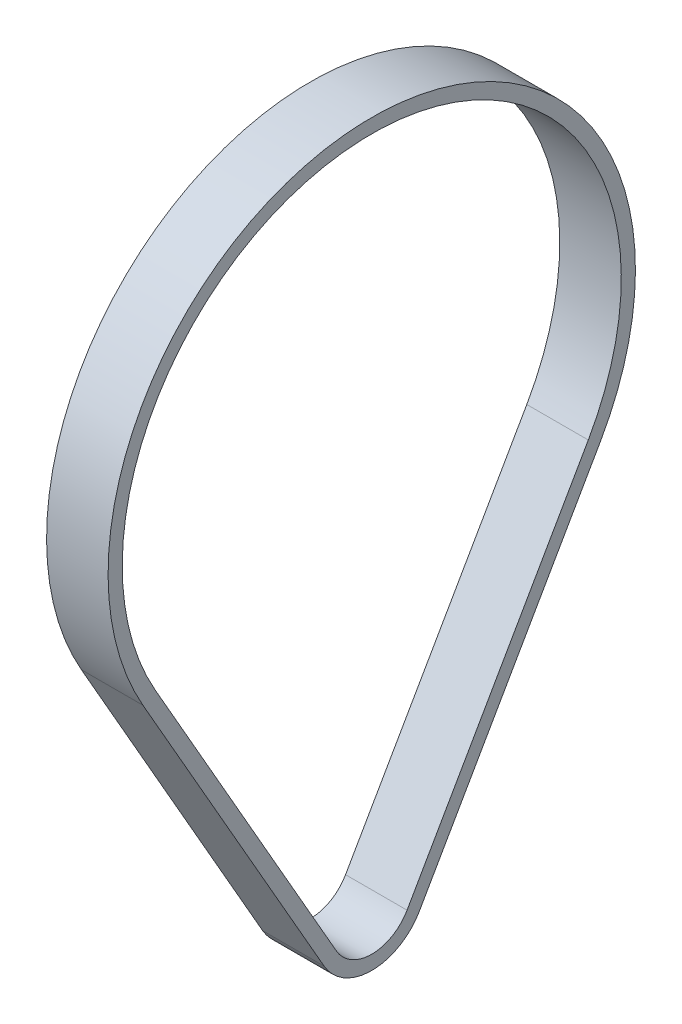
ISO-10303-21;
HEADER;
FILE_DESCRIPTION(('STEP AP214'),'2;1');
FILE_NAME('part.step','',(''),(''),'','','');
FILE_SCHEMA(('AUTOMOTIVE_DESIGN { 1 0 10303 214 1 1 1 1 }'));
ENDSEC;
DATA;
#1=APPLICATION_CONTEXT('core data for automotive mechanical design processes');
#2=APPLICATION_PROTOCOL_DEFINITION('international standard','automotive_design',2000,#1);
#3=PRODUCT_CONTEXT('',#1,'mechanical');
#4=PRODUCT('Part','Part','',(#3));
#5=PRODUCT_RELATED_PRODUCT_CATEGORY('part','',(#4));
#6=PRODUCT_DEFINITION_FORMATION('','',#4);
#7=PRODUCT_DEFINITION_CONTEXT('part definition',#1,'design');
#8=PRODUCT_DEFINITION('design','',#6,#7);
#9=PRODUCT_DEFINITION_SHAPE('','',#8);
#10=(LENGTH_UNIT() NAMED_UNIT(*) SI_UNIT(.MILLI.,.METRE.));
#11=(NAMED_UNIT(*) PLANE_ANGLE_UNIT() SI_UNIT($,.RADIAN.));
#12=(NAMED_UNIT(*) SI_UNIT($,.STERADIAN.) SOLID_ANGLE_UNIT());
#13=UNCERTAINTY_MEASURE_WITH_UNIT(LENGTH_MEASURE(1.E-05),#10,'distance_accuracy_value','');
#14=(GEOMETRIC_REPRESENTATION_CONTEXT(3) GLOBAL_UNCERTAINTY_ASSIGNED_CONTEXT((#13)) GLOBAL_UNIT_ASSIGNED_CONTEXT((#10,
#11,#12)) REPRESENTATION_CONTEXT('',''));
#15=CARTESIAN_POINT('',(0.,0.,0.));
#16=DIRECTION('',(0.,0.,1.));
#17=DIRECTION('',(1.,0.,0.));
#18=AXIS2_PLACEMENT_3D('',#15,#16,#17);
#19=CARTESIAN_POINT('',(12.8585622310635,-9.46787761437065,-111.827265379254));
#20=DIRECTION('',(-1.,0.,0.));
#21=DIRECTION('',(0.,0.,1.));
#22=AXIS2_PLACEMENT_3D('',#19,#20,#21);
#23=PLANE('',#22);
#24=DIRECTION('',(0.,0.867848303661285,-0.49682926829267));
#25=VECTOR('',#24,1.);
#26=CARTESIAN_POINT('',(12.8585622310635,-42.1247929802243,-115.271755296486));
#27=LINE('',#26,#25);
#28=CARTESIAN_POINT('',(12.8585622310635,-42.1247929802243,-115.271755296486));
#29=VERTEX_POINT('',#28);
#30=CARTESIAN_POINT('',(12.8585622310635,-11.2452051753459,-132.949825242066));
#31=VERTEX_POINT('',#30);
#32=EDGE_CURVE('E109',#29,#31,#27,.T.);
#33=ORIENTED_EDGE('',*,*,#32,.F.);
#34=CARTESIAN_POINT('',(12.8585622310635,-40.1528776143707,-111.827265379254));
#35=DIRECTION('',(1.,0.,0.));
#36=DIRECTION('',(0.,-0.496829268292669,-0.867848303661286));
#37=AXIS2_PLACEMENT_3D('',#34,#35,#36);
#38=CIRCLE('',#37,3.969);
#39=CARTESIAN_POINT('',(12.8585622310635,-42.1247929802244,-108.382775462023));
#40=VERTEX_POINT('',#39);
#41=EDGE_CURVE('E115',#40,#29,#38,.T.);
#42=ORIENTED_EDGE('',*,*,#41,.F.);
#43=DIRECTION('',(0.,-0.867848303661272,-0.496829268292693));
#44=VECTOR('',#43,1.);
#45=CARTESIAN_POINT('',(12.8585622310635,-11.2452051753465,-90.7047055164422));
#46=LINE('',#45,#44);
#47=CARTESIAN_POINT('',(12.8585622310635,-11.2452051753465,-90.7047055164422));
#48=VERTEX_POINT('',#47);
#49=EDGE_CURVE('E112',#48,#40,#46,.T.);
#50=ORIENTED_EDGE('',*,*,#49,.F.);
#51=CARTESIAN_POINT('',(12.8585622310635,0.847122385629406,-111.827265379254));
#52=DIRECTION('',(1.,0.,0.));
#53=DIRECTION('',(0.,-0.496829268292693,0.867848303661272));
#54=AXIS2_PLACEMENT_3D('',#51,#52,#53);
#55=CIRCLE('',#54,24.339);
#56=EDGE_CURVE('E99',#31,#48,#55,.T.);
#57=ORIENTED_EDGE('',*,*,#56,.F.);
#58=EDGE_LOOP('',(#33,#42,#50,#57));
#59=FACE_BOUND('',#58,.T.);
#60=CARTESIAN_POINT('',(12.8585622310635,-40.1528776143707,-111.827265379254));
#61=DIRECTION('',(-1.,0.,0.));
#62=DIRECTION('',(0.,-0.496829268292669,-0.867848303661286));
#63=AXIS2_PLACEMENT_3D('',#60,#61,#62);
#64=CIRCLE('',#63,5.349);
#65=CARTESIAN_POINT('',(12.8585622310635,-42.8104173704682,-116.469385955539));
#66=VERTEX_POINT('',#65);
#67=CARTESIAN_POINT('',(12.8585622310635,-42.8104173704683,-107.18514480297));
#68=VERTEX_POINT('',#67);
#69=EDGE_CURVE('E11',#66,#68,#64,.T.);
#70=ORIENTED_EDGE('',*,*,#69,.F.);
#71=DIRECTION('',(0.,-0.867848303661285,0.49682926829267));
#72=VECTOR('',#71,1.);
#73=CARTESIAN_POINT('',(12.8585622310635,-42.8104173704682,-116.469385955539));
#74=LINE('',#73,#72);
#75=CARTESIAN_POINT('',(12.8585622310635,-11.9308295655897,-134.147455901119));
#76=VERTEX_POINT('',#75);
#77=EDGE_CURVE('E156',#76,#66,#74,.T.);
#78=ORIENTED_EDGE('',*,*,#77,.F.);
#79=CARTESIAN_POINT('',(12.8585622310635,0.847122385629406,-111.827265379254));
#80=DIRECTION('',(-1.,0.,0.));
#81=DIRECTION('',(0.,-0.496829268292693,0.867848303661272));
#82=AXIS2_PLACEMENT_3D('',#79,#80,#81);
#83=CIRCLE('',#82,25.719);
#84=CARTESIAN_POINT('',(12.8585622310635,-11.9308295655904,-89.5070748573897));
#85=VERTEX_POINT('',#84);
#86=EDGE_CURVE('E152',#85,#76,#83,.T.);
#87=ORIENTED_EDGE('',*,*,#86,.F.);
#88=DIRECTION('',(0.,0.867848303661272,0.496829268292693));
#89=VECTOR('',#88,1.);
#90=CARTESIAN_POINT('',(12.8585622310635,-11.9308295655904,-89.5070748573897));
#91=LINE('',#90,#89);
#92=EDGE_CURVE('E28',#68,#85,#91,.T.);
#93=ORIENTED_EDGE('',*,*,#92,.F.);
#94=EDGE_LOOP('',(#70,#78,#87,#93));
#95=FACE_BOUND('',#94,.T.);
#96=ADVANCED_FACE('F17',(#59,#95),#23,.F.);
#97=CARTESIAN_POINT('',(9.85856223106352,-40.1528776143707,-111.827265379254));
#98=DIRECTION('',(-1.,0.,0.));
#99=DIRECTION('',(0.,-0.496829268292669,-0.867848303661286));
#100=AXIS2_PLACEMENT_3D('',#97,#98,#99);
#101=CYLINDRICAL_SURFACE('',#100,5.349);
#102=DIRECTION('',(1.,0.,0.));
#103=VECTOR('',#102,1.);
#104=CARTESIAN_POINT('',(9.85856223106352,-42.8104173704683,-107.18514480297));
#105=LINE('',#104,#103);
#106=CARTESIAN_POINT('',(6.85856223106352,-42.8104173704683,-107.18514480297));
#107=VERTEX_POINT('',#106);
#108=EDGE_CURVE('E155',#107,#68,#105,.T.);
#109=ORIENTED_EDGE('',*,*,#108,.F.);
#110=CARTESIAN_POINT('',(6.85856223106352,-40.1528776143707,-111.827265379254));
#111=DIRECTION('',(1.,0.,0.));
#112=DIRECTION('',(0.,-0.496829268292669,-0.867848303661286));
#113=AXIS2_PLACEMENT_3D('',#110,#111,#112);
#114=CIRCLE('',#113,5.349);
#115=CARTESIAN_POINT('',(6.85856223106352,-42.8104173704682,-116.469385955539));
#116=VERTEX_POINT('',#115);
#117=EDGE_CURVE('E139',#107,#116,#114,.T.);
#118=ORIENTED_EDGE('',*,*,#117,.T.);
#119=DIRECTION('',(-1.,0.,0.));
#120=VECTOR('',#119,1.);
#121=CARTESIAN_POINT('',(9.85856223106352,-42.8104173704682,-116.469385955539));
#122=LINE('',#121,#120);
#123=EDGE_CURVE('E151',#66,#116,#122,.T.);
#124=ORIENTED_EDGE('',*,*,#123,.F.);
#125=ORIENTED_EDGE('',*,*,#69,.T.);
#126=EDGE_LOOP('',(#109,#118,#124,#125));
#127=FACE_BOUND('',#126,.T.);
#128=ADVANCED_FACE('F19',(#127),#101,.T.);
#129=CARTESIAN_POINT('',(9.85856223106352,-42.8104173704683,-107.18514480297));
#130=DIRECTION('',(0.,0.496829268292693,-0.867848303661272));
#131=DIRECTION('',(-1.,0.,0.));
#132=AXIS2_PLACEMENT_3D('',#129,#130,#131);
#133=PLANE('',#132);
#134=DIRECTION('',(1.,0.,0.));
#135=VECTOR('',#134,1.);
#136=CARTESIAN_POINT('',(9.85856223106352,-11.9308295655904,-89.5070748573897));
#137=LINE('',#136,#135);
#138=CARTESIAN_POINT('',(6.85856223106352,-11.9308295655904,-89.5070748573897));
#139=VERTEX_POINT('',#138);
#140=EDGE_CURVE('E21',#139,#85,#137,.T.);
#141=ORIENTED_EDGE('',*,*,#140,.F.);
#142=DIRECTION('',(0.,-0.867848303661272,-0.496829268292693));
#143=VECTOR('',#142,1.);
#144=CARTESIAN_POINT('',(6.85856223106352,-11.9308295655904,-89.5070748573897));
#145=LINE('',#144,#143);
#146=EDGE_CURVE('E134',#139,#107,#145,.T.);
#147=ORIENTED_EDGE('',*,*,#146,.T.);
#148=ORIENTED_EDGE('',*,*,#108,.T.);
#149=ORIENTED_EDGE('',*,*,#92,.T.);
#150=EDGE_LOOP('',(#141,#147,#148,#149));
#151=FACE_BOUND('',#150,.T.);
#152=ADVANCED_FACE('F317',(#151),#133,.F.);
#153=CARTESIAN_POINT('',(9.85856223106352,0.847122385629406,-111.827265379254));
#154=DIRECTION('',(-1.,0.,0.));
#155=DIRECTION('',(0.,1.,0.));
#156=AXIS2_PLACEMENT_3D('',#153,#154,#155);
#157=CYLINDRICAL_SURFACE('',#156,25.719);
#158=DIRECTION('',(1.,0.,0.));
#159=VECTOR('',#158,1.);
#160=CARTESIAN_POINT('',(9.85856223106352,-11.9308295655897,-134.147455901119));
#161=LINE('',#160,#159);
#162=CARTESIAN_POINT('',(6.85856223106352,-11.9308295655897,-134.147455901119));
#163=VERTEX_POINT('',#162);
#164=EDGE_CURVE('E160',#163,#76,#161,.T.);
#165=ORIENTED_EDGE('',*,*,#164,.F.);
#166=CARTESIAN_POINT('',(6.85856223106352,0.847122385629406,-111.827265379254));
#167=DIRECTION('',(1.,0.,0.));
#168=DIRECTION('',(0.,-0.496829268292693,0.867848303661272));
#169=AXIS2_PLACEMENT_3D('',#166,#167,#168);
#170=CIRCLE('',#169,25.719);
#171=EDGE_CURVE('E138',#163,#139,#170,.T.);
#172=ORIENTED_EDGE('',*,*,#171,.T.);
#173=ORIENTED_EDGE('',*,*,#140,.T.);
#174=ORIENTED_EDGE('',*,*,#86,.T.);
#175=EDGE_LOOP('',(#165,#172,#173,#174));
#176=FACE_BOUND('',#175,.T.);
#177=ADVANCED_FACE('F306',(#176),#157,.T.);
#178=CARTESIAN_POINT('',(9.85856223106352,-11.9308295655897,-134.147455901119));
#179=DIRECTION('',(0.,0.49682926829267,0.867848303661285));
#180=DIRECTION('',(1.,0.,0.));
#181=AXIS2_PLACEMENT_3D('',#178,#179,#180);
#182=PLANE('',#181);
#183=ORIENTED_EDGE('',*,*,#123,.T.);
#184=DIRECTION('',(0.,0.867848303661285,-0.49682926829267));
#185=VECTOR('',#184,1.);
#186=CARTESIAN_POINT('',(6.85856223106352,-42.8104173704682,-116.469385955539));
#187=LINE('',#186,#185);
#188=EDGE_CURVE('E144',#116,#163,#187,.T.);
#189=ORIENTED_EDGE('',*,*,#188,.T.);
#190=ORIENTED_EDGE('',*,*,#164,.T.);
#191=ORIENTED_EDGE('',*,*,#77,.T.);
#192=EDGE_LOOP('',(#183,#189,#190,#191));
#193=FACE_BOUND('',#192,.T.);
#194=ADVANCED_FACE('F295',(#193),#182,.F.);
#195=CARTESIAN_POINT('',(9.85856223106352,-42.1247929802243,-115.271755296486));
#196=DIRECTION('',(0.,-0.49682926829267,-0.867848303661285));
#197=DIRECTION('',(0.,-0.867848303661285,0.49682926829267));
#198=AXIS2_PLACEMENT_3D('',#195,#196,#197);
#199=PLANE('',#198);
#200=DIRECTION('',(1.,0.,0.));
#201=VECTOR('',#200,1.);
#202=CARTESIAN_POINT('',(9.85856223106352,-11.2452051753459,-132.949825242066));
#203=LINE('',#202,#201);
#204=CARTESIAN_POINT('',(6.85856223106352,-11.2452051753459,-132.949825242066));
#205=VERTEX_POINT('',#204);
#206=EDGE_CURVE('E106',#205,#31,#203,.T.);
#207=ORIENTED_EDGE('',*,*,#206,.F.);
#208=DIRECTION('',(0.,-0.867848303661285,0.49682926829267));
#209=VECTOR('',#208,1.);
#210=CARTESIAN_POINT('',(6.85856223106352,-42.1247929802243,-115.271755296486));
#211=LINE('',#210,#209);
#212=CARTESIAN_POINT('',(6.85856223106352,-42.1247929802243,-115.271755296486));
#213=VERTEX_POINT('',#212);
#214=EDGE_CURVE('E140',#205,#213,#211,.T.);
#215=ORIENTED_EDGE('',*,*,#214,.T.);
#216=DIRECTION('',(-1.,0.,0.));
#217=VECTOR('',#216,1.);
#218=CARTESIAN_POINT('',(9.85856223106352,-42.1247929802243,-115.271755296486));
#219=LINE('',#218,#217);
#220=EDGE_CURVE('E171',#29,#213,#219,.T.);
#221=ORIENTED_EDGE('',*,*,#220,.F.);
#222=ORIENTED_EDGE('',*,*,#32,.T.);
#223=EDGE_LOOP('',(#207,#215,#221,#222));
#224=FACE_BOUND('',#223,.T.);
#225=ADVANCED_FACE('F285',(#224),#199,.F.);
#226=CARTESIAN_POINT('',(9.85856223106352,0.847122385629406,-111.827265379254));
#227=DIRECTION('',(-1.,0.,0.));
#228=DIRECTION('',(0.,1.,0.));
#229=AXIS2_PLACEMENT_3D('',#226,#227,#228);
#230=CYLINDRICAL_SURFACE('',#229,24.339);
#231=DIRECTION('',(1.,0.,0.));
#232=VECTOR('',#231,1.);
#233=CARTESIAN_POINT('',(9.85856223106352,-11.2452051753465,-90.7047055164422));
#234=LINE('',#233,#232);
#235=CARTESIAN_POINT('',(6.85856223106352,-11.2452051753465,-90.7047055164422));
#236=VERTEX_POINT('',#235);
#237=EDGE_CURVE('E104',#236,#48,#234,.T.);
#238=ORIENTED_EDGE('',*,*,#237,.F.);
#239=CARTESIAN_POINT('',(6.85856223106352,0.847122385629406,-111.827265379254));
#240=DIRECTION('',(-1.,0.,0.));
#241=DIRECTION('',(0.,-0.496829268292693,0.867848303661272));
#242=AXIS2_PLACEMENT_3D('',#239,#240,#241);
#243=CIRCLE('',#242,24.339);
#244=EDGE_CURVE('E143',#236,#205,#243,.T.);
#245=ORIENTED_EDGE('',*,*,#244,.T.);
#246=ORIENTED_EDGE('',*,*,#206,.T.);
#247=ORIENTED_EDGE('',*,*,#56,.T.);
#248=EDGE_LOOP('',(#238,#245,#246,#247));
#249=FACE_BOUND('',#248,.T.);
#250=ADVANCED_FACE('F101',(#249),#230,.F.);
#251=CARTESIAN_POINT('',(9.85856223106352,-11.2452051753465,-90.7047055164422));
#252=DIRECTION('',(0.,-0.496829268292693,0.867848303661272));
#253=DIRECTION('',(-1.,0.,0.));
#254=AXIS2_PLACEMENT_3D('',#251,#252,#253);
#255=PLANE('',#254);
#256=DIRECTION('',(1.,0.,0.));
#257=VECTOR('',#256,1.);
#258=CARTESIAN_POINT('',(9.85856223106352,-42.1247929802244,-108.382775462023));
#259=LINE('',#258,#257);
#260=CARTESIAN_POINT('',(6.85856223106352,-42.1247929802244,-108.382775462023));
#261=VERTEX_POINT('',#260);
#262=EDGE_CURVE('E130',#261,#40,#259,.T.);
#263=ORIENTED_EDGE('',*,*,#262,.F.);
#264=DIRECTION('',(0.,0.867848303661272,0.496829268292693));
#265=VECTOR('',#264,1.);
#266=CARTESIAN_POINT('',(6.85856223106352,-11.2452051753465,-90.7047055164422));
#267=LINE('',#266,#265);
#268=EDGE_CURVE('E122',#261,#236,#267,.T.);
#269=ORIENTED_EDGE('',*,*,#268,.T.);
#270=ORIENTED_EDGE('',*,*,#237,.T.);
#271=ORIENTED_EDGE('',*,*,#49,.T.);
#272=EDGE_LOOP('',(#263,#269,#270,#271));
#273=FACE_BOUND('',#272,.T.);
#274=ADVANCED_FACE('F120',(#273),#255,.F.);
#275=CARTESIAN_POINT('',(9.85856223106352,-40.1528776143707,-111.827265379254));
#276=DIRECTION('',(-1.,0.,0.));
#277=DIRECTION('',(0.,-0.496829268292669,-0.867848303661286));
#278=AXIS2_PLACEMENT_3D('',#275,#276,#277);
#279=CYLINDRICAL_SURFACE('',#278,3.969);
#280=ORIENTED_EDGE('',*,*,#220,.T.);
#281=CARTESIAN_POINT('',(6.85856223106352,-40.1528776143707,-111.827265379254));
#282=DIRECTION('',(-1.,0.,0.));
#283=DIRECTION('',(0.,-0.496829268292669,-0.867848303661286));
#284=AXIS2_PLACEMENT_3D('',#281,#282,#283);
#285=CIRCLE('',#284,3.969);
#286=EDGE_CURVE('E148',#213,#261,#285,.T.);
#287=ORIENTED_EDGE('',*,*,#286,.T.);
#288=ORIENTED_EDGE('',*,*,#262,.T.);
#289=ORIENTED_EDGE('',*,*,#41,.T.);
#290=EDGE_LOOP('',(#280,#287,#288,#289));
#291=FACE_BOUND('',#290,.T.);
#292=ADVANCED_FACE('F253',(#291),#279,.F.);
#293=CARTESIAN_POINT('',(6.85856223106352,-9.46787761437065,-111.827265379254));
#294=DIRECTION('',(-1.,0.,0.));
#295=DIRECTION('',(0.,0.,1.));
#296=AXIS2_PLACEMENT_3D('',#293,#294,#295);
#297=PLANE('',#296);
#298=ORIENTED_EDGE('',*,*,#214,.F.);
#299=ORIENTED_EDGE('',*,*,#244,.F.);
#300=ORIENTED_EDGE('',*,*,#268,.F.);
#301=ORIENTED_EDGE('',*,*,#286,.F.);
#302=EDGE_LOOP('',(#298,#299,#300,#301));
#303=FACE_BOUND('',#302,.T.);
#304=ORIENTED_EDGE('',*,*,#117,.F.);
#305=ORIENTED_EDGE('',*,*,#146,.F.);
#306=ORIENTED_EDGE('',*,*,#171,.F.);
#307=ORIENTED_EDGE('',*,*,#188,.F.);
#308=EDGE_LOOP('',(#304,#305,#306,#307));
#309=FACE_BOUND('',#308,.T.);
#310=ADVANCED_FACE('F247',(#303,#309),#297,.T.);
#311=CLOSED_SHELL('',(#96,#128,#152,#177,#194,#225,#250,#274,#292,#310));
#312=MANIFOLD_SOLID_BREP('B1',#311);
#313=ADVANCED_BREP_SHAPE_REPRESENTATION('',(#18,#312),#14);
#314=SHAPE_DEFINITION_REPRESENTATION(#9,#313);
ENDSEC;
END-ISO-10303-21;
